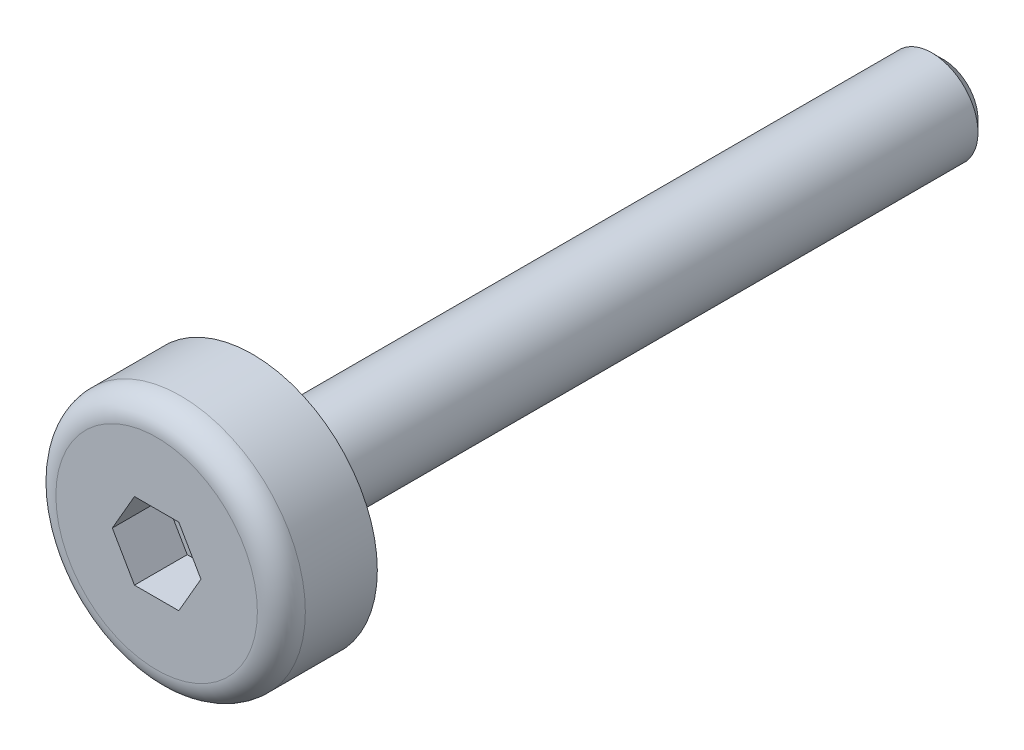
ISO-10303-21;
HEADER;
FILE_DESCRIPTION(('STEP AP214'),'2;1');
FILE_NAME('part.step','',(''),(''),'','','');
FILE_SCHEMA(('AUTOMOTIVE_DESIGN { 1 0 10303 214 1 1 1 1 }'));
ENDSEC;
DATA;
#1=APPLICATION_CONTEXT('core data for automotive mechanical design processes');
#2=APPLICATION_PROTOCOL_DEFINITION('international standard','automotive_design',2000,#1);
#3=PRODUCT_CONTEXT('',#1,'mechanical');
#4=PRODUCT('Part','Part','',(#3));
#5=PRODUCT_RELATED_PRODUCT_CATEGORY('part','',(#4));
#6=PRODUCT_DEFINITION_FORMATION('','',#4);
#7=PRODUCT_DEFINITION_CONTEXT('part definition',#1,'design');
#8=PRODUCT_DEFINITION('design','',#6,#7);
#9=PRODUCT_DEFINITION_SHAPE('','',#8);
#10=(LENGTH_UNIT() NAMED_UNIT(*) SI_UNIT(.MILLI.,.METRE.));
#11=(NAMED_UNIT(*) PLANE_ANGLE_UNIT() SI_UNIT($,.RADIAN.));
#12=(NAMED_UNIT(*) SI_UNIT($,.STERADIAN.) SOLID_ANGLE_UNIT());
#13=UNCERTAINTY_MEASURE_WITH_UNIT(LENGTH_MEASURE(1.E-05),#10,'distance_accuracy_value','');
#14=(GEOMETRIC_REPRESENTATION_CONTEXT(3) GLOBAL_UNCERTAINTY_ASSIGNED_CONTEXT((#13)) GLOBAL_UNIT_ASSIGNED_CONTEXT((#10,
#11,#12)) REPRESENTATION_CONTEXT('',''));
#15=CARTESIAN_POINT('',(0.,0.,0.));
#16=DIRECTION('',(0.,0.,1.));
#17=DIRECTION('',(1.,0.,0.));
#18=AXIS2_PLACEMENT_3D('',#15,#16,#17);
#19=CARTESIAN_POINT('',(0.,0.,-18.));
#20=DIRECTION('',(0.,0.,-1.));
#21=DIRECTION('',(-1.,0.,0.));
#22=AXIS2_PLACEMENT_3D('',#19,#20,#21);
#23=PLANE('',#22);
#24=CARTESIAN_POINT('',(0.,0.,-18.));
#25=DIRECTION('',(0.,0.,-1.));
#26=DIRECTION('',(-1.,0.,0.));
#27=AXIS2_PLACEMENT_3D('',#24,#25,#26);
#28=CIRCLE('',#27,0.900000000000007);
#29=CARTESIAN_POINT('',(-0.900000000000007,0.,-18.));
#30=VERTEX_POINT('',#29);
#31=EDGE_CURVE('E156',#30,#30,#28,.T.);
#32=ORIENTED_EDGE('',*,*,#31,.T.);
#33=EDGE_LOOP('',(#32));
#34=FACE_BOUND('',#33,.T.);
#35=ADVANCED_FACE('F40',(#34),#23,.T.);
#36=CARTESIAN_POINT('',(0.,0.,10.123));
#37=DIRECTION('',(0.,0.,1.));
#38=DIRECTION('',(1.,0.,0.));
#39=AXIS2_PLACEMENT_3D('',#36,#37,#38);
#40=CYLINDRICAL_SURFACE('',#39,1.2);
#41=CARTESIAN_POINT('',(0.,0.,-17.7));
#42=DIRECTION('',(0.,0.,-1.));
#43=DIRECTION('',(-1.,0.,0.));
#44=AXIS2_PLACEMENT_3D('',#41,#42,#43);
#45=CIRCLE('',#44,1.2);
#46=CARTESIAN_POINT('',(-1.2,0.,-17.7));
#47=VERTEX_POINT('',#46);
#48=EDGE_CURVE('E153',#47,#47,#45,.F.);
#49=ORIENTED_EDGE('',*,*,#48,.T.);
#50=EDGE_LOOP('',(#49));
#51=FACE_BOUND('',#50,.T.);
#52=CARTESIAN_POINT('',(0.,0.,0.));
#53=DIRECTION('',(0.,0.,1.));
#54=DIRECTION('',(1.,0.,0.));
#55=AXIS2_PLACEMENT_3D('',#52,#53,#54);
#56=CIRCLE('',#55,1.2);
#57=CARTESIAN_POINT('',(1.2,0.,0.));
#58=VERTEX_POINT('',#57);
#59=EDGE_CURVE('E150',#58,#58,#56,.T.);
#60=ORIENTED_EDGE('',*,*,#59,.F.);
#61=EDGE_LOOP('',(#60));
#62=FACE_BOUND('',#61,.T.);
#63=ADVANCED_FACE('F176',(#51,#62),#40,.T.);
#64=CARTESIAN_POINT('',(1.2,0.,0.));
#65=DIRECTION('',(0.,0.,-1.));
#66=DIRECTION('',(-1.,0.,0.));
#67=AXIS2_PLACEMENT_3D('',#64,#65,#66);
#68=PLANE('',#67);
#69=ORIENTED_EDGE('',*,*,#59,.T.);
#70=EDGE_LOOP('',(#69));
#71=FACE_BOUND('',#70,.T.);
#72=CARTESIAN_POINT('',(0.,0.,0.));
#73=DIRECTION('',(0.,0.,1.));
#74=DIRECTION('',(1.,0.,0.));
#75=AXIS2_PLACEMENT_3D('',#72,#73,#74);
#76=CIRCLE('',#75,3.25);
#77=CARTESIAN_POINT('',(3.25,0.,0.));
#78=VERTEX_POINT('',#77);
#79=EDGE_CURVE('E142',#78,#78,#76,.T.);
#80=ORIENTED_EDGE('',*,*,#79,.F.);
#81=EDGE_LOOP('',(#80));
#82=FACE_BOUND('',#81,.T.);
#83=ADVANCED_FACE('F182',(#71,#82),#68,.T.);
#84=CARTESIAN_POINT('',(0.,0.,10.123));
#85=DIRECTION('',(0.,0.,1.));
#86=DIRECTION('',(1.,0.,0.));
#87=AXIS2_PLACEMENT_3D('',#84,#85,#86);
#88=CYLINDRICAL_SURFACE('',#87,3.25);
#89=CARTESIAN_POINT('',(0.,0.,1.875));
#90=DIRECTION('',(0.,0.,1.));
#91=DIRECTION('',(1.,0.,0.));
#92=AXIS2_PLACEMENT_3D('',#89,#90,#91);
#93=CIRCLE('',#92,3.25);
#94=CARTESIAN_POINT('',(3.25,0.,1.875));
#95=VERTEX_POINT('',#94);
#96=EDGE_CURVE('E11',#95,#95,#93,.F.);
#97=ORIENTED_EDGE('',*,*,#96,.T.);
#98=EDGE_LOOP('',(#97));
#99=FACE_BOUND('',#98,.T.);
#100=ORIENTED_EDGE('',*,*,#79,.T.);
#101=EDGE_LOOP('',(#100));
#102=FACE_BOUND('',#101,.T.);
#103=ADVANCED_FACE('F191',(#99,#102),#88,.T.);
#104=CARTESIAN_POINT('',(3.25,0.,2.5));
#105=DIRECTION('',(0.,0.,1.));
#106=DIRECTION('',(1.,0.,0.));
#107=AXIS2_PLACEMENT_3D('',#104,#105,#106);
#108=PLANE('',#107);
#109=DIRECTION('',(0.499999999999995,0.866025403784441,0.));
#110=VECTOR('',#109,1.);
#111=CARTESIAN_POINT('',(0.577350269189637,-0.999999999999993,2.5));
#112=LINE('',#111,#110);
#113=CARTESIAN_POINT('',(0.577350269189637,-0.999999999999993,2.5));
#114=VERTEX_POINT('',#113);
#115=CARTESIAN_POINT('',(1.15470053837925,0.,2.5));
#116=VERTEX_POINT('',#115);
#117=EDGE_CURVE('E55',#114,#116,#112,.T.);
#118=ORIENTED_EDGE('',*,*,#117,.F.);
#119=DIRECTION('',(1.,0.,0.));
#120=VECTOR('',#119,1.);
#121=CARTESIAN_POINT('',(-0.577350269189617,-1.00000000000001,2.5));
#122=LINE('',#121,#120);
#123=CARTESIAN_POINT('',(-0.577350269189617,-1.00000000000001,2.5));
#124=VERTEX_POINT('',#123);
#125=EDGE_CURVE('E138',#124,#114,#122,.T.);
#126=ORIENTED_EDGE('',*,*,#125,.F.);
#127=DIRECTION('',(0.500000000000007,-0.866025403784434,0.));
#128=VECTOR('',#127,1.);
#129=CARTESIAN_POINT('',(-1.15470053837925,0.,2.5));
#130=LINE('',#129,#128);
#131=CARTESIAN_POINT('',(-1.15470053837925,0.,2.5));
#132=VERTEX_POINT('',#131);
#133=EDGE_CURVE('E136',#132,#124,#130,.T.);
#134=ORIENTED_EDGE('',*,*,#133,.F.);
#135=DIRECTION('',(-0.499999999999995,-0.866025403784442,0.));
#136=VECTOR('',#135,1.);
#137=CARTESIAN_POINT('',(-0.57735026918963,0.999999999999998,2.5));
#138=LINE('',#137,#136);
#139=CARTESIAN_POINT('',(-0.57735026918963,0.999999999999998,2.5));
#140=VERTEX_POINT('',#139);
#141=EDGE_CURVE('E103',#140,#132,#138,.T.);
#142=ORIENTED_EDGE('',*,*,#141,.F.);
#143=DIRECTION('',(-1.,0.,0.));
#144=VECTOR('',#143,1.);
#145=CARTESIAN_POINT('',(0.577350269189624,1.,2.5));
#146=LINE('',#145,#144);
#147=CARTESIAN_POINT('',(0.577350269189624,1.,2.5));
#148=VERTEX_POINT('',#147);
#149=EDGE_CURVE('E132',#148,#140,#146,.T.);
#150=ORIENTED_EDGE('',*,*,#149,.F.);
#151=DIRECTION('',(-0.500000000000001,0.866025403784438,0.));
#152=VECTOR('',#151,1.);
#153=CARTESIAN_POINT('',(1.15470053837925,0.,2.5));
#154=LINE('',#153,#152);
#155=EDGE_CURVE('E129',#116,#148,#154,.T.);
#156=ORIENTED_EDGE('',*,*,#155,.F.);
#157=EDGE_LOOP('',(#118,#126,#134,#142,#150,#156));
#158=FACE_BOUND('',#157,.T.);
#159=CARTESIAN_POINT('',(0.,0.,2.5));
#160=DIRECTION('',(0.,0.,1.));
#161=DIRECTION('',(1.,0.,0.));
#162=AXIS2_PLACEMENT_3D('',#159,#160,#161);
#163=CIRCLE('',#162,2.625);
#164=CARTESIAN_POINT('',(2.625,0.,2.5));
#165=VERTEX_POINT('',#164);
#166=EDGE_CURVE('E48',#165,#165,#163,.T.);
#167=ORIENTED_EDGE('',*,*,#166,.T.);
#168=EDGE_LOOP('',(#167));
#169=FACE_BOUND('',#168,.T.);
#170=ADVANCED_FACE('F161',(#158,#169),#108,.T.);
#171=CARTESIAN_POINT('',(0.,0.,-17.7));
#172=DIRECTION('',(0.,0.,1.));
#173=DIRECTION('',(1.,0.,0.));
#174=AXIS2_PLACEMENT_3D('',#171,#172,#173);
#175=CONICAL_SURFACE('',#174,1.2,0.785398163397446);
#176=ORIENTED_EDGE('',*,*,#31,.F.);
#177=EDGE_LOOP('',(#176));
#178=FACE_BOUND('',#177,.T.);
#179=ORIENTED_EDGE('',*,*,#48,.F.);
#180=EDGE_LOOP('',(#179));
#181=FACE_BOUND('',#180,.T.);
#182=ADVANCED_FACE('F165',(#178,#181),#175,.T.);
#183=CARTESIAN_POINT('',(0.,0.,1.875));
#184=DIRECTION('',(0.,0.,1.));
#185=DIRECTION('',(1.,0.,0.));
#186=AXIS2_PLACEMENT_3D('',#183,#184,#185);
#187=TOROIDAL_SURFACE('',#186,2.625,0.625);
#188=ORIENTED_EDGE('',*,*,#96,.F.);
#189=EDGE_LOOP('',(#188));
#190=FACE_BOUND('',#189,.T.);
#191=ORIENTED_EDGE('',*,*,#166,.F.);
#192=EDGE_LOOP('',(#191));
#193=FACE_BOUND('',#192,.T.);
#194=ADVANCED_FACE('F42',(#190,#193),#187,.T.);
#195=CARTESIAN_POINT('',(0.577350269189637,-0.999999999999993,1.125));
#196=DIRECTION('',(0.866025403784441,-0.499999999999995,0.));
#197=DIRECTION('',(0.499999999999995,0.866025403784441,0.));
#198=AXIS2_PLACEMENT_3D('',#195,#196,#197);
#199=PLANE('',#198);
#200=ORIENTED_EDGE('',*,*,#117,.T.);
#201=DIRECTION('',(0.,0.,1.));
#202=VECTOR('',#201,1.);
#203=CARTESIAN_POINT('',(1.15470053837925,0.,1.125));
#204=LINE('',#203,#202);
#205=CARTESIAN_POINT('',(1.15470053837925,0.,1.125));
#206=VERTEX_POINT('',#205);
#207=EDGE_CURVE('E85',#206,#116,#204,.T.);
#208=ORIENTED_EDGE('',*,*,#207,.F.);
#209=DIRECTION('',(0.499999999999995,0.866025403784441,0.));
#210=VECTOR('',#209,1.);
#211=CARTESIAN_POINT('',(0.577350269189637,-0.999999999999993,1.125));
#212=LINE('',#211,#210);
#213=CARTESIAN_POINT('',(0.577350269189637,-0.999999999999993,1.125));
#214=VERTEX_POINT('',#213);
#215=EDGE_CURVE('E140',#214,#206,#212,.T.);
#216=ORIENTED_EDGE('',*,*,#215,.F.);
#217=DIRECTION('',(0.,0.,1.));
#218=VECTOR('',#217,1.);
#219=CARTESIAN_POINT('',(0.577350269189637,-0.999999999999993,1.125));
#220=LINE('',#219,#218);
#221=EDGE_CURVE('E63',#214,#114,#220,.T.);
#222=ORIENTED_EDGE('',*,*,#221,.T.);
#223=EDGE_LOOP('',(#200,#208,#216,#222));
#224=FACE_BOUND('',#223,.T.);
#225=ADVANCED_FACE('F164',(#224),#199,.F.);
#226=CARTESIAN_POINT('',(-0.577350269189617,-1.00000000000001,1.125));
#227=DIRECTION('',(0.,-1.,0.));
#228=DIRECTION('',(1.,0.,0.));
#229=AXIS2_PLACEMENT_3D('',#226,#227,#228);
#230=PLANE('',#229);
#231=ORIENTED_EDGE('',*,*,#125,.T.);
#232=ORIENTED_EDGE('',*,*,#221,.F.);
#233=DIRECTION('',(1.,0.,0.));
#234=VECTOR('',#233,1.);
#235=CARTESIAN_POINT('',(-0.577350269189617,-1.00000000000001,1.125));
#236=LINE('',#235,#234);
#237=CARTESIAN_POINT('',(-0.577350269189617,-1.00000000000001,1.125));
#238=VERTEX_POINT('',#237);
#239=EDGE_CURVE('E115',#238,#214,#236,.T.);
#240=ORIENTED_EDGE('',*,*,#239,.F.);
#241=DIRECTION('',(0.,0.,1.));
#242=VECTOR('',#241,1.);
#243=CARTESIAN_POINT('',(-0.577350269189617,-1.00000000000001,1.125));
#244=LINE('',#243,#242);
#245=EDGE_CURVE('E107',#238,#124,#244,.T.);
#246=ORIENTED_EDGE('',*,*,#245,.T.);
#247=EDGE_LOOP('',(#231,#232,#240,#246));
#248=FACE_BOUND('',#247,.T.);
#249=ADVANCED_FACE('F171',(#248),#230,.F.);
#250=CARTESIAN_POINT('',(-1.15470053837925,0.,1.125));
#251=DIRECTION('',(-0.866025403784435,-0.500000000000007,0.));
#252=DIRECTION('',(0.500000000000007,-0.866025403784435,0.));
#253=AXIS2_PLACEMENT_3D('',#250,#251,#252);
#254=PLANE('',#253);
#255=ORIENTED_EDGE('',*,*,#133,.T.);
#256=ORIENTED_EDGE('',*,*,#245,.F.);
#257=DIRECTION('',(0.500000000000007,-0.866025403784434,0.));
#258=VECTOR('',#257,1.);
#259=CARTESIAN_POINT('',(-1.15470053837925,0.,1.125));
#260=LINE('',#259,#258);
#261=CARTESIAN_POINT('',(-1.15470053837925,0.,1.125));
#262=VERTEX_POINT('',#261);
#263=EDGE_CURVE('E111',#262,#238,#260,.T.);
#264=ORIENTED_EDGE('',*,*,#263,.F.);
#265=DIRECTION('',(0.,0.,1.));
#266=VECTOR('',#265,1.);
#267=CARTESIAN_POINT('',(-1.15470053837925,0.,1.125));
#268=LINE('',#267,#266);
#269=EDGE_CURVE('E96',#262,#132,#268,.T.);
#270=ORIENTED_EDGE('',*,*,#269,.T.);
#271=EDGE_LOOP('',(#255,#256,#264,#270));
#272=FACE_BOUND('',#271,.T.);
#273=ADVANCED_FACE('F112',(#272),#254,.F.);
#274=CARTESIAN_POINT('',(-0.57735026918963,0.999999999999998,1.125));
#275=DIRECTION('',(-0.866025403784442,0.499999999999995,0.));
#276=DIRECTION('',(-0.499999999999995,-0.866025403784441,0.));
#277=AXIS2_PLACEMENT_3D('',#274,#275,#276);
#278=PLANE('',#277);
#279=ORIENTED_EDGE('',*,*,#141,.T.);
#280=ORIENTED_EDGE('',*,*,#269,.F.);
#281=DIRECTION('',(-0.499999999999995,-0.866025403784442,0.));
#282=VECTOR('',#281,1.);
#283=CARTESIAN_POINT('',(-0.57735026918963,0.999999999999998,1.125));
#284=LINE('',#283,#282);
#285=CARTESIAN_POINT('',(-0.57735026918963,0.999999999999998,1.125));
#286=VERTEX_POINT('',#285);
#287=EDGE_CURVE('E100',#286,#262,#284,.T.);
#288=ORIENTED_EDGE('',*,*,#287,.F.);
#289=DIRECTION('',(0.,0.,1.));
#290=VECTOR('',#289,1.);
#291=CARTESIAN_POINT('',(-0.57735026918963,0.999999999999998,1.125));
#292=LINE('',#291,#290);
#293=EDGE_CURVE('E108',#286,#140,#292,.T.);
#294=ORIENTED_EDGE('',*,*,#293,.T.);
#295=EDGE_LOOP('',(#279,#280,#288,#294));
#296=FACE_BOUND('',#295,.T.);
#297=ADVANCED_FACE('F98',(#296),#278,.F.);
#298=CARTESIAN_POINT('',(0.577350269189624,1.,1.125));
#299=DIRECTION('',(0.,1.,0.));
#300=DIRECTION('',(-1.,0.,0.));
#301=AXIS2_PLACEMENT_3D('',#298,#299,#300);
#302=PLANE('',#301);
#303=ORIENTED_EDGE('',*,*,#149,.T.);
#304=ORIENTED_EDGE('',*,*,#293,.F.);
#305=DIRECTION('',(-1.,0.,0.));
#306=VECTOR('',#305,1.);
#307=CARTESIAN_POINT('',(0.577350269189624,1.,1.125));
#308=LINE('',#307,#306);
#309=CARTESIAN_POINT('',(0.577350269189624,1.,1.125));
#310=VERTEX_POINT('',#309);
#311=EDGE_CURVE('E121',#310,#286,#308,.T.);
#312=ORIENTED_EDGE('',*,*,#311,.F.);
#313=DIRECTION('',(0.,0.,1.));
#314=VECTOR('',#313,1.);
#315=CARTESIAN_POINT('',(0.577350269189624,1.,1.125));
#316=LINE('',#315,#314);
#317=EDGE_CURVE('E145',#310,#148,#316,.T.);
#318=ORIENTED_EDGE('',*,*,#317,.T.);
#319=EDGE_LOOP('',(#303,#304,#312,#318));
#320=FACE_BOUND('',#319,.T.);
#321=ADVANCED_FACE('F202',(#320),#302,.F.);
#322=CARTESIAN_POINT('',(1.15470053837925,0.,1.125));
#323=DIRECTION('',(0.866025403784438,0.500000000000001,0.));
#324=DIRECTION('',(-0.500000000000001,0.866025403784438,0.));
#325=AXIS2_PLACEMENT_3D('',#322,#323,#324);
#326=PLANE('',#325);
#327=ORIENTED_EDGE('',*,*,#155,.T.);
#328=ORIENTED_EDGE('',*,*,#317,.F.);
#329=DIRECTION('',(-0.500000000000001,0.866025403784438,0.));
#330=VECTOR('',#329,1.);
#331=CARTESIAN_POINT('',(1.15470053837925,0.,1.125));
#332=LINE('',#331,#330);
#333=EDGE_CURVE('E123',#206,#310,#332,.T.);
#334=ORIENTED_EDGE('',*,*,#333,.F.);
#335=ORIENTED_EDGE('',*,*,#207,.T.);
#336=EDGE_LOOP('',(#327,#328,#334,#335));
#337=FACE_BOUND('',#336,.T.);
#338=ADVANCED_FACE('F199',(#337),#326,.F.);
#339=CARTESIAN_POINT('',(0.,0.,1.125));
#340=DIRECTION('',(0.,0.,1.));
#341=DIRECTION('',(1.,0.,0.));
#342=AXIS2_PLACEMENT_3D('',#339,#340,#341);
#343=PLANE('',#342);
#344=ORIENTED_EDGE('',*,*,#215,.T.);
#345=ORIENTED_EDGE('',*,*,#333,.T.);
#346=ORIENTED_EDGE('',*,*,#311,.T.);
#347=ORIENTED_EDGE('',*,*,#287,.T.);
#348=ORIENTED_EDGE('',*,*,#263,.T.);
#349=ORIENTED_EDGE('',*,*,#239,.T.);
#350=EDGE_LOOP('',(#344,#345,#346,#347,#348,#349));
#351=FACE_BOUND('',#350,.T.);
#352=ADVANCED_FACE('F118',(#351),#343,.T.);
#353=CLOSED_SHELL('',(#35,#63,#83,#103,#170,#182,#194,#225,#249,#273,#297,#321,#338,#352));
#354=MANIFOLD_SOLID_BREP('B2',#353);
#355=ADVANCED_BREP_SHAPE_REPRESENTATION('',(#18,#354),#14);
#356=SHAPE_DEFINITION_REPRESENTATION(#9,#355);
ENDSEC;
END-ISO-10303-21;
